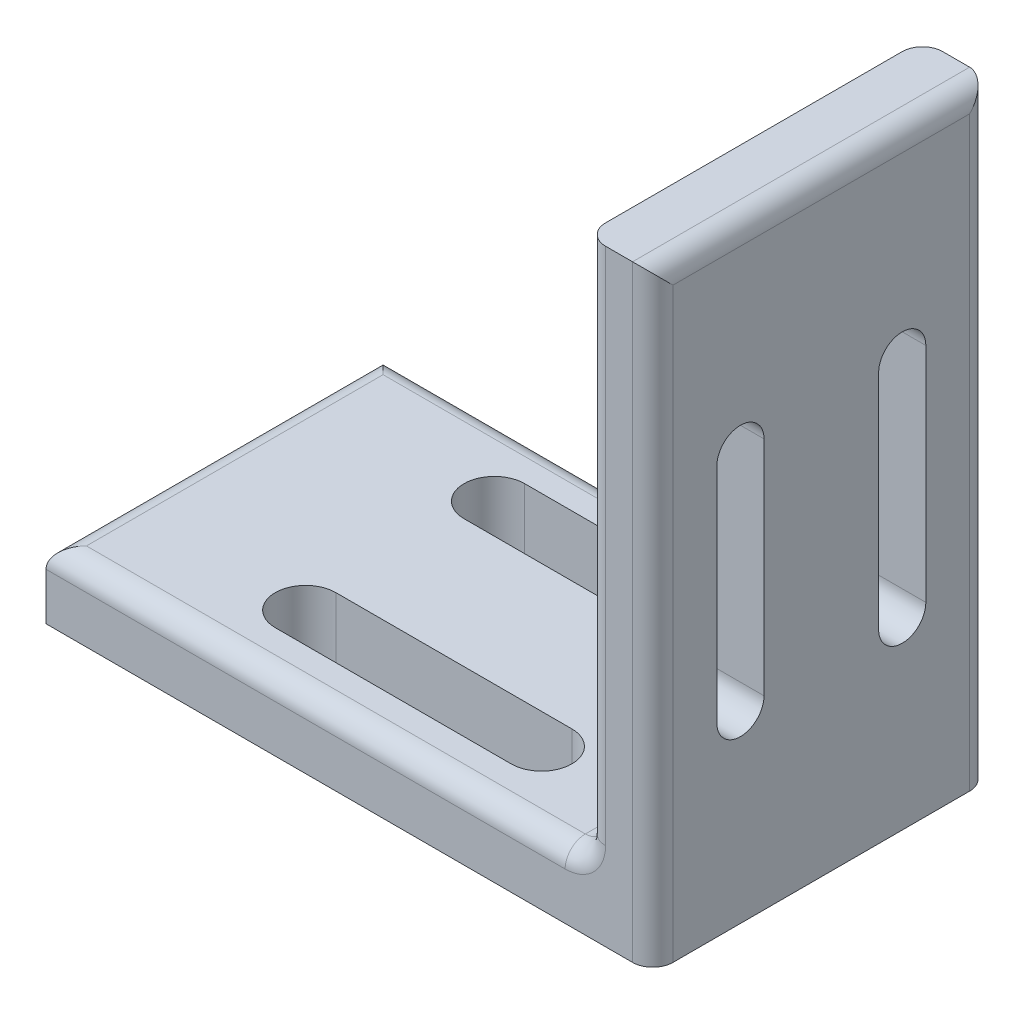
ISO-10303-21;
HEADER;
FILE_DESCRIPTION(('STEP AP214'),'2;1');
FILE_NAME('part.step','',(''),(''),'','','');
FILE_SCHEMA(('AUTOMOTIVE_DESIGN { 1 0 10303 214 1 1 1 1 }'));
ENDSEC;
DATA;
#1=APPLICATION_CONTEXT('core data for automotive mechanical design processes');
#2=APPLICATION_PROTOCOL_DEFINITION('international standard','automotive_design',2000,#1);
#3=PRODUCT_CONTEXT('',#1,'mechanical');
#4=PRODUCT('Part','Part','',(#3));
#5=PRODUCT_RELATED_PRODUCT_CATEGORY('part','',(#4));
#6=PRODUCT_DEFINITION_FORMATION('','',#4);
#7=PRODUCT_DEFINITION_CONTEXT('part definition',#1,'design');
#8=PRODUCT_DEFINITION('design','',#6,#7);
#9=PRODUCT_DEFINITION_SHAPE('','',#8);
#10=(LENGTH_UNIT() NAMED_UNIT(*) SI_UNIT(.MILLI.,.METRE.));
#11=(NAMED_UNIT(*) PLANE_ANGLE_UNIT() SI_UNIT($,.RADIAN.));
#12=(NAMED_UNIT(*) SI_UNIT($,.STERADIAN.) SOLID_ANGLE_UNIT());
#13=UNCERTAINTY_MEASURE_WITH_UNIT(LENGTH_MEASURE(1.E-05),#10,'distance_accuracy_value','');
#14=(GEOMETRIC_REPRESENTATION_CONTEXT(3) GLOBAL_UNCERTAINTY_ASSIGNED_CONTEXT((#13)) GLOBAL_UNIT_ASSIGNED_CONTEXT((#10,
#11,#12)) REPRESENTATION_CONTEXT('',''));
#15=CARTESIAN_POINT('',(0.,0.,0.));
#16=DIRECTION('',(0.,0.,1.));
#17=DIRECTION('',(1.,0.,0.));
#18=AXIS2_PLACEMENT_3D('',#15,#16,#17);
#19=CARTESIAN_POINT('',(22.5,5.,-12.5));
#20=DIRECTION('',(-1.,0.,0.));
#21=DIRECTION('',(0.,0.,1.));
#22=AXIS2_PLACEMENT_3D('',#19,#20,#21);
#23=PLANE('',#22);
#24=DIRECTION('',(0.,1.,0.));
#25=VECTOR('',#24,1.);
#26=CARTESIAN_POINT('',(22.5,30.25,-4.25));
#27=LINE('',#26,#25);
#28=CARTESIAN_POINT('',(22.5,13.75,-4.25));
#29=VERTEX_POINT('',#28);
#30=CARTESIAN_POINT('',(22.5,30.25,-4.25));
#31=VERTEX_POINT('',#30);
#32=EDGE_CURVE('E242',#29,#31,#27,.T.);
#33=ORIENTED_EDGE('',*,*,#32,.T.);
#34=CARTESIAN_POINT('',(22.5,30.25,-6.00000000000001));
#35=DIRECTION('',(-1.,0.,0.));
#36=DIRECTION('',(0.,0.,1.));
#37=AXIS2_PLACEMENT_3D('',#34,#35,#36);
#38=CIRCLE('',#37,1.75);
#39=CARTESIAN_POINT('',(22.5,30.25,-7.75000000000001));
#40=VERTEX_POINT('',#39);
#41=EDGE_CURVE('E234',#31,#40,#38,.T.);
#42=ORIENTED_EDGE('',*,*,#41,.T.);
#43=DIRECTION('',(0.,-1.,0.));
#44=VECTOR('',#43,1.);
#45=CARTESIAN_POINT('',(22.5,30.25,-7.75000000000001));
#46=LINE('',#45,#44);
#47=CARTESIAN_POINT('',(22.5,13.75,-7.75000000000001));
#48=VERTEX_POINT('',#47);
#49=EDGE_CURVE('E246',#40,#48,#46,.T.);
#50=ORIENTED_EDGE('',*,*,#49,.T.);
#51=CARTESIAN_POINT('',(22.5,13.75,-6.00000000000001));
#52=DIRECTION('',(-1.,0.,0.));
#53=DIRECTION('',(0.,0.,1.));
#54=AXIS2_PLACEMENT_3D('',#51,#52,#53);
#55=CIRCLE('',#54,1.75);
#56=EDGE_CURVE('E250',#48,#29,#55,.T.);
#57=ORIENTED_EDGE('',*,*,#56,.T.);
#58=EDGE_LOOP('',(#33,#42,#50,#57));
#59=FACE_BOUND('',#58,.T.);
#60=DIRECTION('',(0.,1.,0.));
#61=VECTOR('',#60,1.);
#62=CARTESIAN_POINT('',(22.5,30.25,7.75));
#63=LINE('',#62,#61);
#64=CARTESIAN_POINT('',(22.5,13.75,7.75));
#65=VERTEX_POINT('',#64);
#66=CARTESIAN_POINT('',(22.5,30.25,7.75));
#67=VERTEX_POINT('',#66);
#68=EDGE_CURVE('E277',#65,#67,#63,.T.);
#69=ORIENTED_EDGE('',*,*,#68,.T.);
#70=CARTESIAN_POINT('',(22.5,30.25,6.));
#71=DIRECTION('',(-1.,0.,0.));
#72=DIRECTION('',(0.,0.,1.));
#73=AXIS2_PLACEMENT_3D('',#70,#71,#72);
#74=CIRCLE('',#73,1.75);
#75=CARTESIAN_POINT('',(22.5,30.25,4.25));
#76=VERTEX_POINT('',#75);
#77=EDGE_CURVE('E289',#67,#76,#74,.T.);
#78=ORIENTED_EDGE('',*,*,#77,.T.);
#79=DIRECTION('',(0.,-1.,0.));
#80=VECTOR('',#79,1.);
#81=CARTESIAN_POINT('',(22.5,30.25,4.25));
#82=LINE('',#81,#80);
#83=CARTESIAN_POINT('',(22.5,13.75,4.25));
#84=VERTEX_POINT('',#83);
#85=EDGE_CURVE('E301',#76,#84,#82,.T.);
#86=ORIENTED_EDGE('',*,*,#85,.T.);
#87=CARTESIAN_POINT('',(22.5,13.75,6.));
#88=DIRECTION('',(-1.,0.,0.));
#89=DIRECTION('',(0.,0.,1.));
#90=AXIS2_PLACEMENT_3D('',#87,#88,#89);
#91=CIRCLE('',#90,1.75);
#92=EDGE_CURVE('E298',#84,#65,#91,.T.);
#93=ORIENTED_EDGE('',*,*,#92,.T.);
#94=EDGE_LOOP('',(#69,#78,#86,#93));
#95=FACE_BOUND('',#94,.T.);
#96=DIRECTION('',(0.,0.,-1.));
#97=VECTOR('',#96,1.);
#98=CARTESIAN_POINT('',(22.5,43.5,-12.5));
#99=LINE('',#98,#97);
#100=CARTESIAN_POINT('',(22.5,43.5,-11.));
#101=VERTEX_POINT('',#100);
#102=CARTESIAN_POINT('',(22.5,43.5,11.));
#103=VERTEX_POINT('',#102);
#104=EDGE_CURVE('E56',#101,#103,#99,.F.);
#105=ORIENTED_EDGE('',*,*,#104,.T.);
#106=DIRECTION('',(0.,-1.,0.));
#107=VECTOR('',#106,1.);
#108=CARTESIAN_POINT('',(22.5,5.,11.));
#109=LINE('',#108,#107);
#110=CARTESIAN_POINT('',(22.5,0.,11.));
#111=VERTEX_POINT('',#110);
#112=EDGE_CURVE('E438',#103,#111,#109,.T.);
#113=ORIENTED_EDGE('',*,*,#112,.T.);
#114=DIRECTION('',(0.,0.,-1.));
#115=VECTOR('',#114,1.);
#116=CARTESIAN_POINT('',(22.5,0.,-12.5));
#117=LINE('',#116,#115);
#118=CARTESIAN_POINT('',(22.5,0.,-11.));
#119=VERTEX_POINT('',#118);
#120=EDGE_CURVE('E342',#111,#119,#117,.T.);
#121=ORIENTED_EDGE('',*,*,#120,.T.);
#122=DIRECTION('',(0.,-1.,0.));
#123=VECTOR('',#122,1.);
#124=CARTESIAN_POINT('',(22.5,5.,-11.));
#125=LINE('',#124,#123);
#126=EDGE_CURVE('E61',#119,#101,#125,.F.);
#127=ORIENTED_EDGE('',*,*,#126,.T.);
#128=EDGE_LOOP('',(#105,#113,#121,#127));
#129=FACE_BOUND('',#128,.T.);
#130=ADVANCED_FACE('F39',(#59,#95,#129),#23,.F.);
#131=CARTESIAN_POINT('',(-22.5,5.,-12.5));
#132=DIRECTION('',(0.,0.,1.));
#133=DIRECTION('',(1.,0.,0.));
#134=AXIS2_PLACEMENT_3D('',#131,#132,#133);
#135=PLANE('',#134);
#136=DIRECTION('',(0.,-1.,0.));
#137=VECTOR('',#136,1.);
#138=CARTESIAN_POINT('',(-22.5,5.,-12.5));
#139=LINE('',#138,#137);
#140=CARTESIAN_POINT('',(-22.5,3.5,-12.5));
#141=VERTEX_POINT('',#140);
#142=CARTESIAN_POINT('',(-22.5,0.,-12.5));
#143=VERTEX_POINT('',#142);
#144=EDGE_CURVE('E390',#141,#143,#139,.T.);
#145=ORIENTED_EDGE('',*,*,#144,.F.);
#146=DIRECTION('',(-1.,0.,0.));
#147=VECTOR('',#146,1.);
#148=CARTESIAN_POINT('',(17.5,3.5,-12.5));
#149=LINE('',#148,#147);
#150=CARTESIAN_POINT('',(16.,3.5,-12.5));
#151=VERTEX_POINT('',#150);
#152=EDGE_CURVE('E421',#141,#151,#149,.F.);
#153=ORIENTED_EDGE('',*,*,#152,.T.);
#154=CARTESIAN_POINT('',(16.,6.5,-12.5));
#155=DIRECTION('',(0.,0.,1.));
#156=DIRECTION('',(1.,0.,0.));
#157=AXIS2_PLACEMENT_3D('',#154,#155,#156);
#158=CIRCLE('',#157,3.);
#159=CARTESIAN_POINT('',(19.,6.5,-12.5));
#160=VERTEX_POINT('',#159);
#161=EDGE_CURVE('E418',#160,#151,#158,.F.);
#162=ORIENTED_EDGE('',*,*,#161,.F.);
#163=DIRECTION('',(0.,-1.,0.));
#164=VECTOR('',#163,1.);
#165=CARTESIAN_POINT('',(19.,5.,-12.5));
#166=LINE('',#165,#164);
#167=CARTESIAN_POINT('',(19.,45.,-12.5));
#168=VERTEX_POINT('',#167);
#169=EDGE_CURVE('E416',#160,#168,#166,.F.);
#170=ORIENTED_EDGE('',*,*,#169,.T.);
#171=DIRECTION('',(-1.,0.,0.));
#172=VECTOR('',#171,1.);
#173=CARTESIAN_POINT('',(22.5,45.,-12.5));
#174=LINE('',#173,#172);
#175=CARTESIAN_POINT('',(21.,45.,-12.5));
#176=VERTEX_POINT('',#175);
#177=EDGE_CURVE('E270',#176,#168,#174,.T.);
#178=ORIENTED_EDGE('',*,*,#177,.F.);
#179=DIRECTION('',(0.,-1.,0.));
#180=VECTOR('',#179,1.);
#181=CARTESIAN_POINT('',(21.,5.,-12.5));
#182=LINE('',#181,#180);
#183=CARTESIAN_POINT('',(21.,0.,-12.5));
#184=VERTEX_POINT('',#183);
#185=EDGE_CURVE('E414',#176,#184,#182,.T.);
#186=ORIENTED_EDGE('',*,*,#185,.T.);
#187=DIRECTION('',(-1.,0.,0.));
#188=VECTOR('',#187,1.);
#189=CARTESIAN_POINT('',(-22.5,0.,-12.5));
#190=LINE('',#189,#188);
#191=EDGE_CURVE('E380',#184,#143,#190,.T.);
#192=ORIENTED_EDGE('',*,*,#191,.T.);
#193=EDGE_LOOP('',(#145,#153,#162,#170,#178,#186,#192));
#194=FACE_BOUND('',#193,.T.);
#195=ADVANCED_FACE('F488',(#194),#135,.F.);
#196=CARTESIAN_POINT('',(-22.5,5.,-12.5));
#197=DIRECTION('',(1.,0.,0.));
#198=DIRECTION('',(0.,0.,-1.));
#199=AXIS2_PLACEMENT_3D('',#196,#197,#198);
#200=PLANE('',#199);
#201=DIRECTION('',(0.,-1.,0.));
#202=VECTOR('',#201,1.);
#203=CARTESIAN_POINT('',(-22.5,5.,12.5));
#204=LINE('',#203,#202);
#205=CARTESIAN_POINT('',(-22.5,3.5,12.5));
#206=VERTEX_POINT('',#205);
#207=CARTESIAN_POINT('',(-22.5,0.,12.5));
#208=VERTEX_POINT('',#207);
#209=EDGE_CURVE('E388',#206,#208,#204,.T.);
#210=ORIENTED_EDGE('',*,*,#209,.F.);
#211=DIRECTION('',(0.,0.,1.));
#212=VECTOR('',#211,1.);
#213=CARTESIAN_POINT('',(-22.5,3.5,-12.5));
#214=LINE('',#213,#212);
#215=EDGE_CURVE('E412',#206,#141,#214,.F.);
#216=ORIENTED_EDGE('',*,*,#215,.T.);
#217=ORIENTED_EDGE('',*,*,#144,.T.);
#218=DIRECTION('',(0.,0.,1.));
#219=VECTOR('',#218,1.);
#220=CARTESIAN_POINT('',(-22.5,0.,-12.5));
#221=LINE('',#220,#219);
#222=EDGE_CURVE('E382',#143,#208,#221,.T.);
#223=ORIENTED_EDGE('',*,*,#222,.T.);
#224=EDGE_LOOP('',(#210,#216,#217,#223));
#225=FACE_BOUND('',#224,.T.);
#226=ADVANCED_FACE('F517',(#225),#200,.F.);
#227=CARTESIAN_POINT('',(-22.5,5.,12.5));
#228=DIRECTION('',(0.,0.,-1.));
#229=DIRECTION('',(-1.,0.,0.));
#230=AXIS2_PLACEMENT_3D('',#227,#228,#229);
#231=PLANE('',#230);
#232=CARTESIAN_POINT('',(16.,6.5,12.5));
#233=DIRECTION('',(0.,0.,-1.));
#234=DIRECTION('',(-1.,0.,0.));
#235=AXIS2_PLACEMENT_3D('',#232,#233,#234);
#236=CIRCLE('',#235,3.);
#237=CARTESIAN_POINT('',(16.,3.5,12.5));
#238=VERTEX_POINT('',#237);
#239=CARTESIAN_POINT('',(19.,6.5,12.5));
#240=VERTEX_POINT('',#239);
#241=EDGE_CURVE('E404',#238,#240,#236,.F.);
#242=ORIENTED_EDGE('',*,*,#241,.F.);
#243=DIRECTION('',(1.,0.,0.));
#244=VECTOR('',#243,1.);
#245=CARTESIAN_POINT('',(-22.5,3.5,12.5));
#246=LINE('',#245,#244);
#247=EDGE_CURVE('E409',#238,#206,#246,.F.);
#248=ORIENTED_EDGE('',*,*,#247,.T.);
#249=ORIENTED_EDGE('',*,*,#209,.T.);
#250=DIRECTION('',(1.,0.,0.));
#251=VECTOR('',#250,1.);
#252=CARTESIAN_POINT('',(-22.5,0.,12.5));
#253=LINE('',#252,#251);
#254=CARTESIAN_POINT('',(21.,0.,12.5));
#255=VERTEX_POINT('',#254);
#256=EDGE_CURVE('E385',#208,#255,#253,.T.);
#257=ORIENTED_EDGE('',*,*,#256,.T.);
#258=DIRECTION('',(0.,-1.,0.));
#259=VECTOR('',#258,1.);
#260=CARTESIAN_POINT('',(21.,5.,12.5));
#261=LINE('',#260,#259);
#262=CARTESIAN_POINT('',(21.,45.,12.5));
#263=VERTEX_POINT('',#262);
#264=EDGE_CURVE('E402',#255,#263,#261,.F.);
#265=ORIENTED_EDGE('',*,*,#264,.T.);
#266=DIRECTION('',(1.,0.,0.));
#267=VECTOR('',#266,1.);
#268=CARTESIAN_POINT('',(22.5,45.,12.5));
#269=LINE('',#268,#267);
#270=CARTESIAN_POINT('',(19.,45.,12.5));
#271=VERTEX_POINT('',#270);
#272=EDGE_CURVE('E311',#271,#263,#269,.T.);
#273=ORIENTED_EDGE('',*,*,#272,.F.);
#274=DIRECTION('',(0.,-1.,0.));
#275=VECTOR('',#274,1.);
#276=CARTESIAN_POINT('',(19.,5.,12.5));
#277=LINE('',#276,#275);
#278=EDGE_CURVE('E407',#271,#240,#277,.T.);
#279=ORIENTED_EDGE('',*,*,#278,.T.);
#280=EDGE_LOOP('',(#242,#248,#249,#257,#265,#273,#279));
#281=FACE_BOUND('',#280,.T.);
#282=ADVANCED_FACE('F514',(#281),#231,.F.);
#283=CARTESIAN_POINT('',(0.,5.,0.));
#284=DIRECTION('',(0.,1.,0.));
#285=DIRECTION('',(0.,0.,1.));
#286=AXIS2_PLACEMENT_3D('',#283,#284,#285);
#287=PLANE('',#286);
#288=DIRECTION('',(0.,0.,1.));
#289=VECTOR('',#288,1.);
#290=CARTESIAN_POINT('',(-21.,5.,12.5));
#291=LINE('',#290,#289);
#292=CARTESIAN_POINT('',(-21.,5.,-11.));
#293=VERTEX_POINT('',#292);
#294=CARTESIAN_POINT('',(-21.,5.,11.));
#295=VERTEX_POINT('',#294);
#296=EDGE_CURVE('E397',#293,#295,#291,.T.);
#297=ORIENTED_EDGE('',*,*,#296,.T.);
#298=DIRECTION('',(1.,0.,0.));
#299=VECTOR('',#298,1.);
#300=CARTESIAN_POINT('',(17.5,5.,11.));
#301=LINE('',#300,#299);
#302=CARTESIAN_POINT('',(16.,5.,11.));
#303=VERTEX_POINT('',#302);
#304=EDGE_CURVE('E399',#295,#303,#301,.T.);
#305=ORIENTED_EDGE('',*,*,#304,.T.);
#306=DIRECTION('',(0.,0.,1.));
#307=VECTOR('',#306,1.);
#308=CARTESIAN_POINT('',(16.,5.,0.));
#309=LINE('',#308,#307);
#310=CARTESIAN_POINT('',(16.,5.,-11.));
#311=VERTEX_POINT('',#310);
#312=EDGE_CURVE('E393',#303,#311,#309,.F.);
#313=ORIENTED_EDGE('',*,*,#312,.T.);
#314=DIRECTION('',(-1.,0.,0.));
#315=VECTOR('',#314,1.);
#316=CARTESIAN_POINT('',(-22.5,5.,-11.));
#317=LINE('',#316,#315);
#318=EDGE_CURVE('E395',#311,#293,#317,.T.);
#319=ORIENTED_EDGE('',*,*,#318,.T.);
#320=EDGE_LOOP('',(#297,#305,#313,#319));
#321=FACE_BOUND('',#320,.T.);
#322=CARTESIAN_POINT('',(-8.75,5.,-7.));
#323=DIRECTION('',(0.,1.,0.));
#324=DIRECTION('',(0.,0.,1.));
#325=AXIS2_PLACEMENT_3D('',#322,#323,#324);
#326=CIRCLE('',#325,2.25);
#327=CARTESIAN_POINT('',(-8.75,5.,-9.25));
#328=VERTEX_POINT('',#327);
#329=CARTESIAN_POINT('',(-8.75,5.,-4.75));
#330=VERTEX_POINT('',#329);
#331=EDGE_CURVE('E329',#328,#330,#326,.T.);
#332=ORIENTED_EDGE('',*,*,#331,.F.);
#333=DIRECTION('',(-1.,0.,0.));
#334=VECTOR('',#333,1.);
#335=CARTESIAN_POINT('',(-8.75,5.,-9.25));
#336=LINE('',#335,#334);
#337=CARTESIAN_POINT('',(8.75,5.,-9.25));
#338=VERTEX_POINT('',#337);
#339=EDGE_CURVE('E319',#338,#328,#336,.T.);
#340=ORIENTED_EDGE('',*,*,#339,.F.);
#341=CARTESIAN_POINT('',(8.75,5.,-7.));
#342=DIRECTION('',(0.,1.,0.));
#343=DIRECTION('',(0.,0.,1.));
#344=AXIS2_PLACEMENT_3D('',#341,#342,#343);
#345=CIRCLE('',#344,2.25);
#346=CARTESIAN_POINT('',(8.75,5.,-4.75));
#347=VERTEX_POINT('',#346);
#348=EDGE_CURVE('E335',#347,#338,#345,.T.);
#349=ORIENTED_EDGE('',*,*,#348,.F.);
#350=DIRECTION('',(1.,0.,0.));
#351=VECTOR('',#350,1.);
#352=CARTESIAN_POINT('',(-8.75,5.,-4.75));
#353=LINE('',#352,#351);
#354=EDGE_CURVE('E331',#330,#347,#353,.T.);
#355=ORIENTED_EDGE('',*,*,#354,.F.);
#356=EDGE_LOOP('',(#332,#340,#349,#355));
#357=FACE_BOUND('',#356,.T.);
#358=CARTESIAN_POINT('',(-8.75,5.,7.));
#359=DIRECTION('',(0.,1.,0.));
#360=DIRECTION('',(0.,0.,1.));
#361=AXIS2_PLACEMENT_3D('',#358,#359,#360);
#362=CIRCLE('',#361,2.25);
#363=CARTESIAN_POINT('',(-8.75,5.,4.75));
#364=VERTEX_POINT('',#363);
#365=CARTESIAN_POINT('',(-8.75,5.,9.25));
#366=VERTEX_POINT('',#365);
#367=EDGE_CURVE('E332',#364,#366,#362,.T.);
#368=ORIENTED_EDGE('',*,*,#367,.F.);
#369=DIRECTION('',(-1.,0.,0.));
#370=VECTOR('',#369,1.);
#371=CARTESIAN_POINT('',(-8.75,5.,4.75));
#372=LINE('',#371,#370);
#373=CARTESIAN_POINT('',(8.75,5.,4.75));
#374=VERTEX_POINT('',#373);
#375=EDGE_CURVE('E358',#374,#364,#372,.T.);
#376=ORIENTED_EDGE('',*,*,#375,.F.);
#377=CARTESIAN_POINT('',(8.75,5.,7.));
#378=DIRECTION('',(0.,1.,0.));
#379=DIRECTION('',(0.,0.,1.));
#380=AXIS2_PLACEMENT_3D('',#377,#378,#379);
#381=CIRCLE('',#380,2.25);
#382=CARTESIAN_POINT('',(8.75,5.,9.25));
#383=VERTEX_POINT('',#382);
#384=EDGE_CURVE('E361',#383,#374,#381,.T.);
#385=ORIENTED_EDGE('',*,*,#384,.F.);
#386=DIRECTION('',(1.,0.,0.));
#387=VECTOR('',#386,1.);
#388=CARTESIAN_POINT('',(-8.75,5.,9.25));
#389=LINE('',#388,#387);
#390=EDGE_CURVE('E365',#366,#383,#389,.T.);
#391=ORIENTED_EDGE('',*,*,#390,.F.);
#392=EDGE_LOOP('',(#368,#376,#385,#391));
#393=FACE_BOUND('',#392,.T.);
#394=ADVANCED_FACE('F529',(#321,#357,#393),#287,.T.);
#395=CARTESIAN_POINT('',(0.,0.,0.));
#396=DIRECTION('',(0.,1.,0.));
#397=DIRECTION('',(0.,0.,1.));
#398=AXIS2_PLACEMENT_3D('',#395,#396,#397);
#399=PLANE('',#398);
#400=DIRECTION('',(-1.,0.,0.));
#401=VECTOR('',#400,1.);
#402=CARTESIAN_POINT('',(-8.75,0.,-9.25));
#403=LINE('',#402,#401);
#404=CARTESIAN_POINT('',(8.75,0.,-9.25));
#405=VERTEX_POINT('',#404);
#406=CARTESIAN_POINT('',(-8.75,0.,-9.25));
#407=VERTEX_POINT('',#406);
#408=EDGE_CURVE('E325',#405,#407,#403,.T.);
#409=ORIENTED_EDGE('',*,*,#408,.T.);
#410=CARTESIAN_POINT('',(-8.75,0.,-7.));
#411=DIRECTION('',(0.,1.,0.));
#412=DIRECTION('',(0.,0.,1.));
#413=AXIS2_PLACEMENT_3D('',#410,#411,#412);
#414=CIRCLE('',#413,2.25);
#415=CARTESIAN_POINT('',(-8.75,0.,-4.75));
#416=VERTEX_POINT('',#415);
#417=EDGE_CURVE('E315',#407,#416,#414,.T.);
#418=ORIENTED_EDGE('',*,*,#417,.T.);
#419=DIRECTION('',(1.,0.,0.));
#420=VECTOR('',#419,1.);
#421=CARTESIAN_POINT('',(-8.75,0.,-4.75));
#422=LINE('',#421,#420);
#423=CARTESIAN_POINT('',(8.75,0.,-4.75));
#424=VERTEX_POINT('',#423);
#425=EDGE_CURVE('E318',#416,#424,#422,.T.);
#426=ORIENTED_EDGE('',*,*,#425,.T.);
#427=CARTESIAN_POINT('',(8.75,0.,-7.));
#428=DIRECTION('',(0.,1.,0.));
#429=DIRECTION('',(0.,0.,1.));
#430=AXIS2_PLACEMENT_3D('',#427,#428,#429);
#431=CIRCLE('',#430,2.25);
#432=EDGE_CURVE('E322',#424,#405,#431,.T.);
#433=ORIENTED_EDGE('',*,*,#432,.T.);
#434=EDGE_LOOP('',(#409,#418,#426,#433));
#435=FACE_BOUND('',#434,.T.);
#436=DIRECTION('',(-1.,0.,0.));
#437=VECTOR('',#436,1.);
#438=CARTESIAN_POINT('',(-8.75,0.,4.75));
#439=LINE('',#438,#437);
#440=CARTESIAN_POINT('',(8.75,0.,4.75));
#441=VERTEX_POINT('',#440);
#442=CARTESIAN_POINT('',(-8.75,0.,4.75));
#443=VERTEX_POINT('',#442);
#444=EDGE_CURVE('E352',#441,#443,#439,.T.);
#445=ORIENTED_EDGE('',*,*,#444,.T.);
#446=CARTESIAN_POINT('',(-8.75,0.,7.));
#447=DIRECTION('',(0.,1.,0.));
#448=DIRECTION('',(0.,0.,1.));
#449=AXIS2_PLACEMENT_3D('',#446,#447,#448);
#450=CIRCLE('',#449,2.25);
#451=CARTESIAN_POINT('',(-8.75,0.,9.25));
#452=VERTEX_POINT('',#451);
#453=EDGE_CURVE('E362',#443,#452,#450,.T.);
#454=ORIENTED_EDGE('',*,*,#453,.T.);
#455=DIRECTION('',(1.,0.,0.));
#456=VECTOR('',#455,1.);
#457=CARTESIAN_POINT('',(-8.75,0.,9.25));
#458=LINE('',#457,#456);
#459=CARTESIAN_POINT('',(8.75,0.,9.25));
#460=VERTEX_POINT('',#459);
#461=EDGE_CURVE('E374',#452,#460,#458,.T.);
#462=ORIENTED_EDGE('',*,*,#461,.T.);
#463=CARTESIAN_POINT('',(8.75,0.,7.));
#464=DIRECTION('',(0.,1.,0.));
#465=DIRECTION('',(0.,0.,1.));
#466=AXIS2_PLACEMENT_3D('',#463,#464,#465);
#467=CIRCLE('',#466,2.25);
#468=EDGE_CURVE('E371',#460,#441,#467,.T.);
#469=ORIENTED_EDGE('',*,*,#468,.T.);
#470=EDGE_LOOP('',(#445,#454,#462,#469));
#471=FACE_BOUND('',#470,.T.);
#472=ORIENTED_EDGE('',*,*,#120,.F.);
#473=CARTESIAN_POINT('',(21.,0.,11.));
#474=DIRECTION('',(0.,1.,0.));
#475=DIRECTION('',(0.,0.,1.));
#476=AXIS2_PLACEMENT_3D('',#473,#474,#475);
#477=CIRCLE('',#476,1.5);
#478=EDGE_CURVE('E11',#111,#255,#477,.F.);
#479=ORIENTED_EDGE('',*,*,#478,.T.);
#480=ORIENTED_EDGE('',*,*,#256,.F.);
#481=ORIENTED_EDGE('',*,*,#222,.F.);
#482=ORIENTED_EDGE('',*,*,#191,.F.);
#483=CARTESIAN_POINT('',(21.,0.,-11.));
#484=DIRECTION('',(0.,1.,0.));
#485=DIRECTION('',(0.,0.,1.));
#486=AXIS2_PLACEMENT_3D('',#483,#484,#485);
#487=CIRCLE('',#486,1.5);
#488=EDGE_CURVE('E48',#184,#119,#487,.F.);
#489=ORIENTED_EDGE('',*,*,#488,.T.);
#490=EDGE_LOOP('',(#472,#479,#480,#481,#482,#489));
#491=FACE_BOUND('',#490,.T.);
#492=ADVANCED_FACE('F474',(#435,#471,#491),#399,.F.);
#493=CARTESIAN_POINT('',(-8.75,0.,7.));
#494=DIRECTION('',(0.,1.,0.));
#495=DIRECTION('',(0.,0.,1.));
#496=AXIS2_PLACEMENT_3D('',#493,#494,#495);
#497=CYLINDRICAL_SURFACE('',#496,2.25);
#498=ORIENTED_EDGE('',*,*,#367,.T.);
#499=DIRECTION('',(0.,1.,0.));
#500=VECTOR('',#499,1.);
#501=CARTESIAN_POINT('',(-8.75,0.,9.25));
#502=LINE('',#501,#500);
#503=EDGE_CURVE('E349',#452,#366,#502,.T.);
#504=ORIENTED_EDGE('',*,*,#503,.F.);
#505=ORIENTED_EDGE('',*,*,#453,.F.);
#506=DIRECTION('',(0.,1.,0.));
#507=VECTOR('',#506,1.);
#508=CARTESIAN_POINT('',(-8.75,0.,4.75));
#509=LINE('',#508,#507);
#510=EDGE_CURVE('E314',#443,#364,#509,.T.);
#511=ORIENTED_EDGE('',*,*,#510,.T.);
#512=EDGE_LOOP('',(#498,#504,#505,#511));
#513=FACE_BOUND('',#512,.T.);
#514=ADVANCED_FACE('F559',(#513),#497,.F.);
#515=CARTESIAN_POINT('',(-8.75,0.,4.75));
#516=DIRECTION('',(0.,0.,-1.));
#517=DIRECTION('',(-1.,0.,0.));
#518=AXIS2_PLACEMENT_3D('',#515,#516,#517);
#519=PLANE('',#518);
#520=ORIENTED_EDGE('',*,*,#375,.T.);
#521=ORIENTED_EDGE('',*,*,#510,.F.);
#522=ORIENTED_EDGE('',*,*,#444,.F.);
#523=DIRECTION('',(0.,1.,0.));
#524=VECTOR('',#523,1.);
#525=CARTESIAN_POINT('',(8.75,0.,4.75));
#526=LINE('',#525,#524);
#527=EDGE_CURVE('E355',#441,#374,#526,.T.);
#528=ORIENTED_EDGE('',*,*,#527,.T.);
#529=EDGE_LOOP('',(#520,#521,#522,#528));
#530=FACE_BOUND('',#529,.T.);
#531=ADVANCED_FACE('F563',(#530),#519,.F.);
#532=CARTESIAN_POINT('',(8.75,0.,7.));
#533=DIRECTION('',(0.,1.,0.));
#534=DIRECTION('',(0.,0.,1.));
#535=AXIS2_PLACEMENT_3D('',#532,#533,#534);
#536=CYLINDRICAL_SURFACE('',#535,2.25);
#537=ORIENTED_EDGE('',*,*,#384,.T.);
#538=ORIENTED_EDGE('',*,*,#527,.F.);
#539=ORIENTED_EDGE('',*,*,#468,.F.);
#540=DIRECTION('',(0.,1.,0.));
#541=VECTOR('',#540,1.);
#542=CARTESIAN_POINT('',(8.75,0.,9.25));
#543=LINE('',#542,#541);
#544=EDGE_CURVE('E353',#460,#383,#543,.T.);
#545=ORIENTED_EDGE('',*,*,#544,.T.);
#546=EDGE_LOOP('',(#537,#538,#539,#545));
#547=FACE_BOUND('',#546,.T.);
#548=ADVANCED_FACE('F566',(#547),#536,.F.);
#549=CARTESIAN_POINT('',(-8.75,0.,9.25));
#550=DIRECTION('',(0.,0.,1.));
#551=DIRECTION('',(1.,0.,0.));
#552=AXIS2_PLACEMENT_3D('',#549,#550,#551);
#553=PLANE('',#552);
#554=ORIENTED_EDGE('',*,*,#390,.T.);
#555=ORIENTED_EDGE('',*,*,#544,.F.);
#556=ORIENTED_EDGE('',*,*,#461,.F.);
#557=ORIENTED_EDGE('',*,*,#503,.T.);
#558=EDGE_LOOP('',(#554,#555,#556,#557));
#559=FACE_BOUND('',#558,.T.);
#560=ADVANCED_FACE('F570',(#559),#553,.F.);
#561=CARTESIAN_POINT('',(-8.75,0.,-7.));
#562=DIRECTION('',(0.,1.,0.));
#563=DIRECTION('',(0.,0.,1.));
#564=AXIS2_PLACEMENT_3D('',#561,#562,#563);
#565=CYLINDRICAL_SURFACE('',#564,2.25);
#566=ORIENTED_EDGE('',*,*,#331,.T.);
#567=DIRECTION('',(0.,1.,0.));
#568=VECTOR('',#567,1.);
#569=CARTESIAN_POINT('',(-8.75,0.,-4.75));
#570=LINE('',#569,#568);
#571=EDGE_CURVE('E328',#416,#330,#570,.T.);
#572=ORIENTED_EDGE('',*,*,#571,.F.);
#573=ORIENTED_EDGE('',*,*,#417,.F.);
#574=DIRECTION('',(0.,1.,0.));
#575=VECTOR('',#574,1.);
#576=CARTESIAN_POINT('',(-8.75,0.,-9.25));
#577=LINE('',#576,#575);
#578=EDGE_CURVE('E340',#407,#328,#577,.T.);
#579=ORIENTED_EDGE('',*,*,#578,.T.);
#580=EDGE_LOOP('',(#566,#572,#573,#579));
#581=FACE_BOUND('',#580,.T.);
#582=ADVANCED_FACE('F574',(#581),#565,.F.);
#583=CARTESIAN_POINT('',(-8.75,0.,-9.25));
#584=DIRECTION('',(0.,0.,-1.));
#585=DIRECTION('',(-1.,0.,0.));
#586=AXIS2_PLACEMENT_3D('',#583,#584,#585);
#587=PLANE('',#586);
#588=ORIENTED_EDGE('',*,*,#339,.T.);
#589=ORIENTED_EDGE('',*,*,#578,.F.);
#590=ORIENTED_EDGE('',*,*,#408,.F.);
#591=DIRECTION('',(0.,1.,0.));
#592=VECTOR('',#591,1.);
#593=CARTESIAN_POINT('',(8.75,0.,-9.25));
#594=LINE('',#593,#592);
#595=EDGE_CURVE('E343',#405,#338,#594,.T.);
#596=ORIENTED_EDGE('',*,*,#595,.T.);
#597=EDGE_LOOP('',(#588,#589,#590,#596));
#598=FACE_BOUND('',#597,.T.);
#599=ADVANCED_FACE('F581',(#598),#587,.F.);
#600=CARTESIAN_POINT('',(8.75,0.,-7.));
#601=DIRECTION('',(0.,1.,0.));
#602=DIRECTION('',(0.,0.,1.));
#603=AXIS2_PLACEMENT_3D('',#600,#601,#602);
#604=CYLINDRICAL_SURFACE('',#603,2.25);
#605=ORIENTED_EDGE('',*,*,#348,.T.);
#606=ORIENTED_EDGE('',*,*,#595,.F.);
#607=ORIENTED_EDGE('',*,*,#432,.F.);
#608=DIRECTION('',(0.,1.,0.));
#609=VECTOR('',#608,1.);
#610=CARTESIAN_POINT('',(8.75,0.,-4.75));
#611=LINE('',#610,#609);
#612=EDGE_CURVE('E345',#424,#347,#611,.T.);
#613=ORIENTED_EDGE('',*,*,#612,.T.);
#614=EDGE_LOOP('',(#605,#606,#607,#613));
#615=FACE_BOUND('',#614,.T.);
#616=ADVANCED_FACE('F586',(#615),#604,.F.);
#617=CARTESIAN_POINT('',(-8.75,0.,-4.75));
#618=DIRECTION('',(0.,0.,1.));
#619=DIRECTION('',(1.,0.,0.));
#620=AXIS2_PLACEMENT_3D('',#617,#618,#619);
#621=PLANE('',#620);
#622=ORIENTED_EDGE('',*,*,#354,.T.);
#623=ORIENTED_EDGE('',*,*,#612,.F.);
#624=ORIENTED_EDGE('',*,*,#425,.F.);
#625=ORIENTED_EDGE('',*,*,#571,.T.);
#626=EDGE_LOOP('',(#622,#623,#624,#625));
#627=FACE_BOUND('',#626,.T.);
#628=ADVANCED_FACE('F583',(#627),#621,.F.);
#629=CARTESIAN_POINT('',(17.5,45.,-12.5));
#630=DIRECTION('',(1.,0.,0.));
#631=DIRECTION('',(0.,0.,-1.));
#632=AXIS2_PLACEMENT_3D('',#629,#630,#631);
#633=PLANE('',#632);
#634=DIRECTION('',(0.,-1.,0.));
#635=VECTOR('',#634,1.);
#636=CARTESIAN_POINT('',(17.5,30.25,-7.75000000000001));
#637=LINE('',#636,#635);
#638=CARTESIAN_POINT('',(17.5,30.25,-7.75000000000001));
#639=VERTEX_POINT('',#638);
#640=CARTESIAN_POINT('',(17.5,13.75,-7.75000000000001));
#641=VERTEX_POINT('',#640);
#642=EDGE_CURVE('E263',#639,#641,#637,.T.);
#643=ORIENTED_EDGE('',*,*,#642,.F.);
#644=CARTESIAN_POINT('',(17.5,30.25,-6.00000000000001));
#645=DIRECTION('',(-1.,0.,0.));
#646=DIRECTION('',(0.,0.,1.));
#647=AXIS2_PLACEMENT_3D('',#644,#645,#646);
#648=CIRCLE('',#647,1.75);
#649=CARTESIAN_POINT('',(17.5,30.25,-4.25));
#650=VERTEX_POINT('',#649);
#651=EDGE_CURVE('E237',#650,#639,#648,.T.);
#652=ORIENTED_EDGE('',*,*,#651,.F.);
#653=DIRECTION('',(0.,1.,0.));
#654=VECTOR('',#653,1.);
#655=CARTESIAN_POINT('',(17.5,30.25,-4.25));
#656=LINE('',#655,#654);
#657=CARTESIAN_POINT('',(17.5,13.75,-4.25));
#658=VERTEX_POINT('',#657);
#659=EDGE_CURVE('E254',#658,#650,#656,.T.);
#660=ORIENTED_EDGE('',*,*,#659,.F.);
#661=CARTESIAN_POINT('',(17.5,13.75,-6.00000000000001));
#662=DIRECTION('',(-1.,0.,0.));
#663=DIRECTION('',(0.,0.,1.));
#664=AXIS2_PLACEMENT_3D('',#661,#662,#663);
#665=CIRCLE('',#664,1.75);
#666=EDGE_CURVE('E257',#641,#658,#665,.T.);
#667=ORIENTED_EDGE('',*,*,#666,.F.);
#668=EDGE_LOOP('',(#643,#652,#660,#667));
#669=FACE_BOUND('',#668,.T.);
#670=DIRECTION('',(0.,-1.,0.));
#671=VECTOR('',#670,1.);
#672=CARTESIAN_POINT('',(17.5,30.25,4.25));
#673=LINE('',#672,#671);
#674=CARTESIAN_POINT('',(17.5,30.25,4.25));
#675=VERTEX_POINT('',#674);
#676=CARTESIAN_POINT('',(17.5,13.75,4.25));
#677=VERTEX_POINT('',#676);
#678=EDGE_CURVE('E292',#675,#677,#673,.T.);
#679=ORIENTED_EDGE('',*,*,#678,.F.);
#680=CARTESIAN_POINT('',(17.5,30.25,6.));
#681=DIRECTION('',(-1.,0.,0.));
#682=DIRECTION('',(0.,0.,1.));
#683=AXIS2_PLACEMENT_3D('',#680,#681,#682);
#684=CIRCLE('',#683,1.75);
#685=CARTESIAN_POINT('',(17.5,30.25,7.75));
#686=VERTEX_POINT('',#685);
#687=EDGE_CURVE('E264',#686,#675,#684,.T.);
#688=ORIENTED_EDGE('',*,*,#687,.F.);
#689=DIRECTION('',(0.,1.,0.));
#690=VECTOR('',#689,1.);
#691=CARTESIAN_POINT('',(17.5,30.25,7.75));
#692=LINE('',#691,#690);
#693=CARTESIAN_POINT('',(17.5,13.75,7.75));
#694=VERTEX_POINT('',#693);
#695=EDGE_CURVE('E285',#694,#686,#692,.T.);
#696=ORIENTED_EDGE('',*,*,#695,.F.);
#697=CARTESIAN_POINT('',(17.5,13.75,6.));
#698=DIRECTION('',(-1.,0.,0.));
#699=DIRECTION('',(0.,0.,1.));
#700=AXIS2_PLACEMENT_3D('',#697,#698,#699);
#701=CIRCLE('',#700,1.75);
#702=EDGE_CURVE('E288',#677,#694,#701,.T.);
#703=ORIENTED_EDGE('',*,*,#702,.F.);
#704=EDGE_LOOP('',(#679,#688,#696,#703));
#705=FACE_BOUND('',#704,.T.);
#706=DIRECTION('',(0.,0.,1.));
#707=VECTOR('',#706,1.);
#708=CARTESIAN_POINT('',(17.5,6.5,-12.5));
#709=LINE('',#708,#707);
#710=CARTESIAN_POINT('',(17.5,6.5,-11.));
#711=VERTEX_POINT('',#710);
#712=CARTESIAN_POINT('',(17.5,6.5,11.));
#713=VERTEX_POINT('',#712);
#714=EDGE_CURVE('E425',#711,#713,#709,.T.);
#715=ORIENTED_EDGE('',*,*,#714,.T.);
#716=DIRECTION('',(0.,-1.,0.));
#717=VECTOR('',#716,1.);
#718=CARTESIAN_POINT('',(17.5,45.,11.));
#719=LINE('',#718,#717);
#720=CARTESIAN_POINT('',(17.5,45.,11.));
#721=VERTEX_POINT('',#720);
#722=EDGE_CURVE('E427',#713,#721,#719,.F.);
#723=ORIENTED_EDGE('',*,*,#722,.T.);
#724=DIRECTION('',(0.,0.,1.));
#725=VECTOR('',#724,1.);
#726=CARTESIAN_POINT('',(17.5,45.,-12.5));
#727=LINE('',#726,#725);
#728=CARTESIAN_POINT('',(17.5,45.,-11.));
#729=VERTEX_POINT('',#728);
#730=EDGE_CURVE('E308',#729,#721,#727,.T.);
#731=ORIENTED_EDGE('',*,*,#730,.F.);
#732=DIRECTION('',(0.,-1.,0.));
#733=VECTOR('',#732,1.);
#734=CARTESIAN_POINT('',(17.5,45.,-11.));
#735=LINE('',#734,#733);
#736=EDGE_CURVE('E423',#729,#711,#735,.T.);
#737=ORIENTED_EDGE('',*,*,#736,.T.);
#738=EDGE_LOOP('',(#715,#723,#731,#737));
#739=FACE_BOUND('',#738,.T.);
#740=ADVANCED_FACE('F506',(#669,#705,#739),#633,.F.);
#741=CARTESIAN_POINT('',(0.,45.,0.));
#742=DIRECTION('',(0.,-1.,0.));
#743=DIRECTION('',(0.,0.,-1.));
#744=AXIS2_PLACEMENT_3D('',#741,#742,#743);
#745=PLANE('',#744);
#746=ORIENTED_EDGE('',*,*,#272,.T.);
#747=DIRECTION('',(0.,0.,-1.));
#748=VECTOR('',#747,1.);
#749=CARTESIAN_POINT('',(21.,45.,0.));
#750=LINE('',#749,#748);
#751=EDGE_CURVE('E433',#263,#176,#750,.T.);
#752=ORIENTED_EDGE('',*,*,#751,.T.);
#753=ORIENTED_EDGE('',*,*,#177,.T.);
#754=CARTESIAN_POINT('',(19.,45.,-11.));
#755=DIRECTION('',(0.,-1.,0.));
#756=DIRECTION('',(0.,0.,-1.));
#757=AXIS2_PLACEMENT_3D('',#754,#755,#756);
#758=CIRCLE('',#757,1.5);
#759=EDGE_CURVE('E429',#168,#729,#758,.F.);
#760=ORIENTED_EDGE('',*,*,#759,.T.);
#761=ORIENTED_EDGE('',*,*,#730,.T.);
#762=CARTESIAN_POINT('',(19.,45.,11.));
#763=DIRECTION('',(0.,-1.,0.));
#764=DIRECTION('',(0.,0.,-1.));
#765=AXIS2_PLACEMENT_3D('',#762,#763,#764);
#766=CIRCLE('',#765,1.5);
#767=EDGE_CURVE('E431',#721,#271,#766,.F.);
#768=ORIENTED_EDGE('',*,*,#767,.T.);
#769=EDGE_LOOP('',(#746,#752,#753,#760,#761,#768));
#770=FACE_BOUND('',#769,.T.);
#771=ADVANCED_FACE('F484',(#770),#745,.F.);
#772=CARTESIAN_POINT('',(22.5,30.25,6.));
#773=DIRECTION('',(-1.,0.,0.));
#774=DIRECTION('',(0.,0.,1.));
#775=AXIS2_PLACEMENT_3D('',#772,#773,#774);
#776=CYLINDRICAL_SURFACE('',#775,1.75);
#777=ORIENTED_EDGE('',*,*,#687,.T.);
#778=DIRECTION('',(-1.,0.,0.));
#779=VECTOR('',#778,1.);
#780=CARTESIAN_POINT('',(22.5,30.25,4.25));
#781=LINE('',#780,#779);
#782=EDGE_CURVE('E274',#76,#675,#781,.T.);
#783=ORIENTED_EDGE('',*,*,#782,.F.);
#784=ORIENTED_EDGE('',*,*,#77,.F.);
#785=DIRECTION('',(-1.,0.,0.));
#786=VECTOR('',#785,1.);
#787=CARTESIAN_POINT('',(22.5,30.25,7.75));
#788=LINE('',#787,#786);
#789=EDGE_CURVE('E282',#67,#686,#788,.T.);
#790=ORIENTED_EDGE('',*,*,#789,.T.);
#791=EDGE_LOOP('',(#777,#783,#784,#790));
#792=FACE_BOUND('',#791,.T.);
#793=ADVANCED_FACE('F599',(#792),#776,.F.);
#794=CARTESIAN_POINT('',(22.5,30.25,7.75));
#795=DIRECTION('',(0.,0.,1.));
#796=DIRECTION('',(0.,-1.,0.));
#797=AXIS2_PLACEMENT_3D('',#794,#795,#796);
#798=PLANE('',#797);
#799=ORIENTED_EDGE('',*,*,#695,.T.);
#800=ORIENTED_EDGE('',*,*,#789,.F.);
#801=ORIENTED_EDGE('',*,*,#68,.F.);
#802=DIRECTION('',(-1.,0.,0.));
#803=VECTOR('',#802,1.);
#804=CARTESIAN_POINT('',(22.5,13.75,7.75));
#805=LINE('',#804,#803);
#806=EDGE_CURVE('E280',#65,#694,#805,.T.);
#807=ORIENTED_EDGE('',*,*,#806,.T.);
#808=EDGE_LOOP('',(#799,#800,#801,#807));
#809=FACE_BOUND('',#808,.T.);
#810=ADVANCED_FACE('F600',(#809),#798,.F.);
#811=CARTESIAN_POINT('',(22.5,13.75,6.));
#812=DIRECTION('',(-1.,0.,0.));
#813=DIRECTION('',(0.,0.,1.));
#814=AXIS2_PLACEMENT_3D('',#811,#812,#813);
#815=CYLINDRICAL_SURFACE('',#814,1.75);
#816=ORIENTED_EDGE('',*,*,#702,.T.);
#817=ORIENTED_EDGE('',*,*,#806,.F.);
#818=ORIENTED_EDGE('',*,*,#92,.F.);
#819=DIRECTION('',(-1.,0.,0.));
#820=VECTOR('',#819,1.);
#821=CARTESIAN_POINT('',(22.5,13.75,4.25));
#822=LINE('',#821,#820);
#823=EDGE_CURVE('E278',#84,#677,#822,.T.);
#824=ORIENTED_EDGE('',*,*,#823,.T.);
#825=EDGE_LOOP('',(#816,#817,#818,#824));
#826=FACE_BOUND('',#825,.T.);
#827=ADVANCED_FACE('F603',(#826),#815,.F.);
#828=CARTESIAN_POINT('',(22.5,30.25,4.25));
#829=DIRECTION('',(0.,0.,-1.));
#830=DIRECTION('',(0.,1.,0.));
#831=AXIS2_PLACEMENT_3D('',#828,#829,#830);
#832=PLANE('',#831);
#833=ORIENTED_EDGE('',*,*,#678,.T.);
#834=ORIENTED_EDGE('',*,*,#823,.F.);
#835=ORIENTED_EDGE('',*,*,#85,.F.);
#836=ORIENTED_EDGE('',*,*,#782,.T.);
#837=EDGE_LOOP('',(#833,#834,#835,#836));
#838=FACE_BOUND('',#837,.T.);
#839=ADVANCED_FACE('F607',(#838),#832,.F.);
#840=CARTESIAN_POINT('',(22.5,30.25,-6.00000000000001));
#841=DIRECTION('',(-1.,0.,0.));
#842=DIRECTION('',(0.,0.,1.));
#843=AXIS2_PLACEMENT_3D('',#840,#841,#842);
#844=CYLINDRICAL_SURFACE('',#843,1.75);
#845=ORIENTED_EDGE('',*,*,#651,.T.);
#846=DIRECTION('',(-1.,0.,0.));
#847=VECTOR('',#846,1.);
#848=CARTESIAN_POINT('',(22.5,30.25,-7.75000000000001));
#849=LINE('',#848,#847);
#850=EDGE_CURVE('E230',#40,#639,#849,.T.);
#851=ORIENTED_EDGE('',*,*,#850,.F.);
#852=ORIENTED_EDGE('',*,*,#41,.F.);
#853=DIRECTION('',(-1.,0.,0.));
#854=VECTOR('',#853,1.);
#855=CARTESIAN_POINT('',(22.5,30.25,-4.25));
#856=LINE('',#855,#854);
#857=EDGE_CURVE('E268',#31,#650,#856,.T.);
#858=ORIENTED_EDGE('',*,*,#857,.T.);
#859=EDGE_LOOP('',(#845,#851,#852,#858));
#860=FACE_BOUND('',#859,.T.);
#861=ADVANCED_FACE('F232',(#860),#844,.F.);
#862=CARTESIAN_POINT('',(22.5,30.25,-4.25));
#863=DIRECTION('',(0.,0.,1.));
#864=DIRECTION('',(0.,-1.,0.));
#865=AXIS2_PLACEMENT_3D('',#862,#863,#864);
#866=PLANE('',#865);
#867=ORIENTED_EDGE('',*,*,#659,.T.);
#868=ORIENTED_EDGE('',*,*,#857,.F.);
#869=ORIENTED_EDGE('',*,*,#32,.F.);
#870=DIRECTION('',(-1.,0.,0.));
#871=VECTOR('',#870,1.);
#872=CARTESIAN_POINT('',(22.5,13.75,-4.25));
#873=LINE('',#872,#871);
#874=EDGE_CURVE('E271',#29,#658,#873,.T.);
#875=ORIENTED_EDGE('',*,*,#874,.T.);
#876=EDGE_LOOP('',(#867,#868,#869,#875));
#877=FACE_BOUND('',#876,.T.);
#878=ADVANCED_FACE('F617',(#877),#866,.F.);
#879=CARTESIAN_POINT('',(22.5,13.75,-6.00000000000001));
#880=DIRECTION('',(-1.,0.,0.));
#881=DIRECTION('',(0.,0.,1.));
#882=AXIS2_PLACEMENT_3D('',#879,#880,#881);
#883=CYLINDRICAL_SURFACE('',#882,1.75);
#884=ORIENTED_EDGE('',*,*,#666,.T.);
#885=ORIENTED_EDGE('',*,*,#874,.F.);
#886=ORIENTED_EDGE('',*,*,#56,.F.);
#887=DIRECTION('',(-1.,0.,0.));
#888=VECTOR('',#887,1.);
#889=CARTESIAN_POINT('',(22.5,13.75,-7.75000000000001));
#890=LINE('',#889,#888);
#891=EDGE_CURVE('E241',#48,#641,#890,.T.);
#892=ORIENTED_EDGE('',*,*,#891,.T.);
#893=EDGE_LOOP('',(#884,#885,#886,#892));
#894=FACE_BOUND('',#893,.T.);
#895=ADVANCED_FACE('F619',(#894),#883,.F.);
#896=CARTESIAN_POINT('',(22.5,30.25,-7.75000000000001));
#897=DIRECTION('',(0.,0.,-1.));
#898=DIRECTION('',(0.,1.,0.));
#899=AXIS2_PLACEMENT_3D('',#896,#897,#898);
#900=PLANE('',#899);
#901=ORIENTED_EDGE('',*,*,#642,.T.);
#902=ORIENTED_EDGE('',*,*,#891,.F.);
#903=ORIENTED_EDGE('',*,*,#49,.F.);
#904=ORIENTED_EDGE('',*,*,#850,.T.);
#905=EDGE_LOOP('',(#901,#902,#903,#904));
#906=FACE_BOUND('',#905,.T.);
#907=ADVANCED_FACE('F247',(#906),#900,.F.);
#908=CARTESIAN_POINT('',(19.,45.,-11.));
#909=DIRECTION('',(0.,-1.,0.));
#910=DIRECTION('',(0.,0.,-1.));
#911=AXIS2_PLACEMENT_3D('',#908,#909,#910);
#912=CYLINDRICAL_SURFACE('',#911,1.5);
#913=ORIENTED_EDGE('',*,*,#759,.F.);
#914=ORIENTED_EDGE('',*,*,#169,.F.);
#915=CARTESIAN_POINT('',(19.,6.5,-11.));
#916=DIRECTION('',(0.,-1.,0.));
#917=DIRECTION('',(0.,0.,-1.));
#918=AXIS2_PLACEMENT_3D('',#915,#916,#917);
#919=CIRCLE('',#918,1.5);
#920=EDGE_CURVE('E284',#711,#160,#919,.T.);
#921=ORIENTED_EDGE('',*,*,#920,.F.);
#922=ORIENTED_EDGE('',*,*,#736,.F.);
#923=EDGE_LOOP('',(#913,#914,#921,#922));
#924=FACE_BOUND('',#923,.T.);
#925=ADVANCED_FACE('F492',(#924),#912,.T.);
#926=CARTESIAN_POINT('',(16.,6.5,-11.));
#927=DIRECTION('',(0.,0.,1.));
#928=DIRECTION('',(1.,0.,0.));
#929=AXIS2_PLACEMENT_3D('',#926,#927,#928);
#930=TOROIDAL_SURFACE('',#929,3.,1.5);
#931=ORIENTED_EDGE('',*,*,#920,.T.);
#932=ORIENTED_EDGE('',*,*,#161,.T.);
#933=CARTESIAN_POINT('',(16.,3.5,-11.));
#934=DIRECTION('',(1.,0.,0.));
#935=DIRECTION('',(0.,0.,-1.));
#936=AXIS2_PLACEMENT_3D('',#933,#934,#935);
#937=CIRCLE('',#936,1.5);
#938=EDGE_CURVE('E457',#311,#151,#937,.F.);
#939=ORIENTED_EDGE('',*,*,#938,.F.);
#940=CARTESIAN_POINT('',(16.,6.5,-11.));
#941=DIRECTION('',(0.,0.,1.));
#942=DIRECTION('',(1.,0.,0.));
#943=AXIS2_PLACEMENT_3D('',#940,#941,#942);
#944=CIRCLE('',#943,1.5);
#945=EDGE_CURVE('E454',#711,#311,#944,.F.);
#946=ORIENTED_EDGE('',*,*,#945,.F.);
#947=EDGE_LOOP('',(#931,#932,#939,#946));
#948=FACE_BOUND('',#947,.T.);
#949=ADVANCED_FACE('F496',(#948),#930,.T.);
#950=CARTESIAN_POINT('',(0.,3.5,-11.));
#951=DIRECTION('',(1.,0.,0.));
#952=DIRECTION('',(0.,0.,-1.));
#953=AXIS2_PLACEMENT_3D('',#950,#951,#952);
#954=CYLINDRICAL_SURFACE('',#953,1.5);
#955=ORIENTED_EDGE('',*,*,#938,.T.);
#956=ORIENTED_EDGE('',*,*,#152,.F.);
#957=CARTESIAN_POINT('',(-21.,3.5,-11.));
#958=DIRECTION('',(0.707106781186547,0.,-0.707106781186548));
#959=DIRECTION('',(0.707106781186548,0.,0.707106781186547));
#960=AXIS2_PLACEMENT_3D('',#957,#958,#959);
#961=ELLIPSE('',#960,2.12132034355964,1.5);
#962=EDGE_CURVE('E451',#293,#141,#961,.F.);
#963=ORIENTED_EDGE('',*,*,#962,.F.);
#964=ORIENTED_EDGE('',*,*,#318,.F.);
#965=EDGE_LOOP('',(#955,#956,#963,#964));
#966=FACE_BOUND('',#965,.T.);
#967=ADVANCED_FACE('F522',(#966),#954,.T.);
#968=CARTESIAN_POINT('',(16.,6.5,-12.5));
#969=DIRECTION('',(0.,0.,1.));
#970=DIRECTION('',(1.,0.,0.));
#971=AXIS2_PLACEMENT_3D('',#968,#969,#970);
#972=CYLINDRICAL_SURFACE('',#971,1.5);
#973=ORIENTED_EDGE('',*,*,#945,.T.);
#974=ORIENTED_EDGE('',*,*,#312,.F.);
#975=CARTESIAN_POINT('',(16.,6.5,11.));
#976=DIRECTION('',(0.,0.,-1.));
#977=DIRECTION('',(-1.,0.,0.));
#978=AXIS2_PLACEMENT_3D('',#975,#976,#977);
#979=CIRCLE('',#978,1.5);
#980=EDGE_CURVE('E448',#713,#303,#979,.T.);
#981=ORIENTED_EDGE('',*,*,#980,.F.);
#982=ORIENTED_EDGE('',*,*,#714,.F.);
#983=EDGE_LOOP('',(#973,#974,#981,#982));
#984=FACE_BOUND('',#983,.T.);
#985=ADVANCED_FACE('F503',(#984),#972,.F.);
#986=CARTESIAN_POINT('',(19.,5.,11.));
#987=DIRECTION('',(0.,-1.,0.));
#988=DIRECTION('',(0.,0.,-1.));
#989=AXIS2_PLACEMENT_3D('',#986,#987,#988);
#990=CYLINDRICAL_SURFACE('',#989,1.5);
#991=ORIENTED_EDGE('',*,*,#767,.F.);
#992=ORIENTED_EDGE('',*,*,#722,.F.);
#993=CARTESIAN_POINT('',(19.,6.5,11.));
#994=DIRECTION('',(0.,-1.,0.));
#995=DIRECTION('',(0.,0.,-1.));
#996=AXIS2_PLACEMENT_3D('',#993,#994,#995);
#997=CIRCLE('',#996,1.5);
#998=EDGE_CURVE('E445',#240,#713,#997,.T.);
#999=ORIENTED_EDGE('',*,*,#998,.F.);
#1000=ORIENTED_EDGE('',*,*,#278,.F.);
#1001=EDGE_LOOP('',(#991,#992,#999,#1000));
#1002=FACE_BOUND('',#1001,.T.);
#1003=ADVANCED_FACE('F511',(#1002),#990,.T.);
#1004=CARTESIAN_POINT('',(-21.,3.5,0.));
#1005=DIRECTION('',(0.,0.,-1.));
#1006=DIRECTION('',(-1.,0.,0.));
#1007=AXIS2_PLACEMENT_3D('',#1004,#1005,#1006);
#1008=CYLINDRICAL_SURFACE('',#1007,1.5);
#1009=ORIENTED_EDGE('',*,*,#962,.T.);
#1010=ORIENTED_EDGE('',*,*,#215,.F.);
#1011=CARTESIAN_POINT('',(-21.,3.5,11.));
#1012=DIRECTION('',(-0.707106781186548,0.,-0.707106781186547));
#1013=DIRECTION('',(0.707106781186547,0.,-0.707106781186548));
#1014=AXIS2_PLACEMENT_3D('',#1011,#1012,#1013);
#1015=ELLIPSE('',#1014,2.12132034355964,1.5);
#1016=EDGE_CURVE('E443',#295,#206,#1015,.F.);
#1017=ORIENTED_EDGE('',*,*,#1016,.F.);
#1018=ORIENTED_EDGE('',*,*,#296,.F.);
#1019=EDGE_LOOP('',(#1009,#1010,#1017,#1018));
#1020=FACE_BOUND('',#1019,.T.);
#1021=ADVANCED_FACE('F525',(#1020),#1008,.T.);
#1022=CARTESIAN_POINT('',(16.,6.5,11.));
#1023=DIRECTION('',(0.,0.,-1.));
#1024=DIRECTION('',(-1.,0.,0.));
#1025=AXIS2_PLACEMENT_3D('',#1022,#1023,#1024);
#1026=TOROIDAL_SURFACE('',#1025,3.,1.5);
#1027=ORIENTED_EDGE('',*,*,#998,.T.);
#1028=ORIENTED_EDGE('',*,*,#980,.T.);
#1029=CARTESIAN_POINT('',(16.,3.5,11.));
#1030=DIRECTION('',(1.,0.,0.));
#1031=DIRECTION('',(0.,0.,-1.));
#1032=AXIS2_PLACEMENT_3D('',#1029,#1030,#1031);
#1033=CIRCLE('',#1032,1.5);
#1034=EDGE_CURVE('E441',#238,#303,#1033,.F.);
#1035=ORIENTED_EDGE('',*,*,#1034,.F.);
#1036=ORIENTED_EDGE('',*,*,#241,.T.);
#1037=EDGE_LOOP('',(#1027,#1028,#1035,#1036));
#1038=FACE_BOUND('',#1037,.T.);
#1039=ADVANCED_FACE('F536',(#1038),#1026,.T.);
#1040=CARTESIAN_POINT('',(0.,3.5,11.));
#1041=DIRECTION('',(-1.,0.,0.));
#1042=DIRECTION('',(0.,0.,1.));
#1043=AXIS2_PLACEMENT_3D('',#1040,#1041,#1042);
#1044=CYLINDRICAL_SURFACE('',#1043,1.5);
#1045=ORIENTED_EDGE('',*,*,#1016,.T.);
#1046=ORIENTED_EDGE('',*,*,#247,.F.);
#1047=ORIENTED_EDGE('',*,*,#1034,.T.);
#1048=ORIENTED_EDGE('',*,*,#304,.F.);
#1049=EDGE_LOOP('',(#1045,#1046,#1047,#1048));
#1050=FACE_BOUND('',#1049,.T.);
#1051=ADVANCED_FACE('F532',(#1050),#1044,.T.);
#1052=CARTESIAN_POINT('',(21.,5.,11.));
#1053=DIRECTION('',(0.,-1.,0.));
#1054=DIRECTION('',(0.,0.,-1.));
#1055=AXIS2_PLACEMENT_3D('',#1052,#1053,#1054);
#1056=CYLINDRICAL_SURFACE('',#1055,1.5);
#1057=ORIENTED_EDGE('',*,*,#478,.F.);
#1058=ORIENTED_EDGE('',*,*,#112,.F.);
#1059=CARTESIAN_POINT('',(21.,43.5,11.));
#1060=DIRECTION('',(0.,-0.707106781186547,0.707106781186547));
#1061=DIRECTION('',(0.,-0.707106781186547,-0.707106781186547));
#1062=AXIS2_PLACEMENT_3D('',#1059,#1060,#1061);
#1063=ELLIPSE('',#1062,2.12132034355964,1.5);
#1064=EDGE_CURVE('E43',#263,#103,#1063,.F.);
#1065=ORIENTED_EDGE('',*,*,#1064,.F.);
#1066=ORIENTED_EDGE('',*,*,#264,.F.);
#1067=EDGE_LOOP('',(#1057,#1058,#1065,#1066));
#1068=FACE_BOUND('',#1067,.T.);
#1069=ADVANCED_FACE('F41',(#1068),#1056,.T.);
#1070=CARTESIAN_POINT('',(21.,5.,-11.));
#1071=DIRECTION('',(0.,-1.,0.));
#1072=DIRECTION('',(0.,0.,-1.));
#1073=AXIS2_PLACEMENT_3D('',#1070,#1071,#1072);
#1074=CYLINDRICAL_SURFACE('',#1073,1.5);
#1075=ORIENTED_EDGE('',*,*,#488,.F.);
#1076=ORIENTED_EDGE('',*,*,#185,.F.);
#1077=CARTESIAN_POINT('',(21.,43.5,-11.));
#1078=DIRECTION('',(0.,-0.707106781186547,-0.707106781186547));
#1079=DIRECTION('',(0.,-0.707106781186547,0.707106781186547));
#1080=AXIS2_PLACEMENT_3D('',#1077,#1078,#1079);
#1081=ELLIPSE('',#1080,2.12132034355964,1.5);
#1082=EDGE_CURVE('E461',#101,#176,#1081,.F.);
#1083=ORIENTED_EDGE('',*,*,#1082,.F.);
#1084=ORIENTED_EDGE('',*,*,#126,.F.);
#1085=EDGE_LOOP('',(#1075,#1076,#1083,#1084));
#1086=FACE_BOUND('',#1085,.T.);
#1087=ADVANCED_FACE('F480',(#1086),#1074,.T.);
#1088=CARTESIAN_POINT('',(21.,43.5,0.));
#1089=DIRECTION('',(0.,0.,-1.));
#1090=DIRECTION('',(-1.,0.,0.));
#1091=AXIS2_PLACEMENT_3D('',#1088,#1089,#1090);
#1092=CYLINDRICAL_SURFACE('',#1091,1.5);
#1093=ORIENTED_EDGE('',*,*,#1064,.T.);
#1094=ORIENTED_EDGE('',*,*,#104,.F.);
#1095=ORIENTED_EDGE('',*,*,#1082,.T.);
#1096=ORIENTED_EDGE('',*,*,#751,.F.);
#1097=EDGE_LOOP('',(#1093,#1094,#1095,#1096));
#1098=FACE_BOUND('',#1097,.T.);
#1099=ADVANCED_FACE('F468',(#1098),#1092,.T.);
#1100=CLOSED_SHELL('',(#130,#195,#226,#282,#394,#492,#514,#531,#548,#560,#582,#599,#616,#628,
#740,#771,#793,#810,#827,#839,#861,#878,#895,#907,#925,#949,#967,#985,#1003,#1021,#1039,#1051,
#1069,#1087,#1099));
#1101=MANIFOLD_SOLID_BREP('B2',#1100);
#1102=ADVANCED_BREP_SHAPE_REPRESENTATION('',(#18,#1101),#14);
#1103=SHAPE_DEFINITION_REPRESENTATION(#9,#1102);
ENDSEC;
END-ISO-10303-21;
